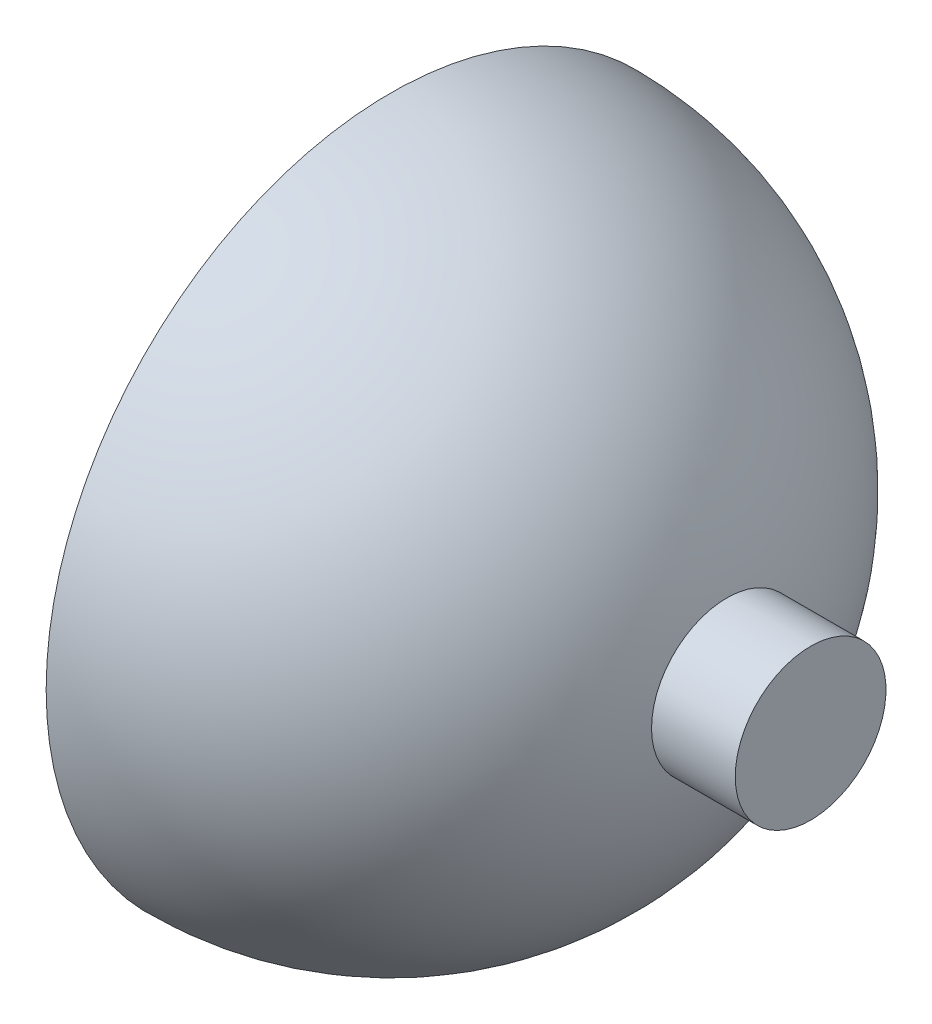
ISO-10303-21;
HEADER;
FILE_DESCRIPTION(('STEP AP214'),'2;1');
FILE_NAME('part.step','',(''),(''),'','','');
FILE_SCHEMA(('AUTOMOTIVE_DESIGN { 1 0 10303 214 1 1 1 1 }'));
ENDSEC;
DATA;
#1=APPLICATION_CONTEXT('core data for automotive mechanical design processes');
#2=APPLICATION_PROTOCOL_DEFINITION('international standard','automotive_design',2000,#1);
#3=PRODUCT_CONTEXT('',#1,'mechanical');
#4=PRODUCT('Part','Part','',(#3));
#5=PRODUCT_RELATED_PRODUCT_CATEGORY('part','',(#4));
#6=PRODUCT_DEFINITION_FORMATION('','',#4);
#7=PRODUCT_DEFINITION_CONTEXT('part definition',#1,'design');
#8=PRODUCT_DEFINITION('design','',#6,#7);
#9=PRODUCT_DEFINITION_SHAPE('','',#8);
#10=(LENGTH_UNIT() NAMED_UNIT(*) SI_UNIT(.MILLI.,.METRE.));
#11=(NAMED_UNIT(*) PLANE_ANGLE_UNIT() SI_UNIT($,.RADIAN.));
#12=(NAMED_UNIT(*) SI_UNIT($,.STERADIAN.) SOLID_ANGLE_UNIT());
#13=UNCERTAINTY_MEASURE_WITH_UNIT(LENGTH_MEASURE(1.E-05),#10,'distance_accuracy_value','');
#14=(GEOMETRIC_REPRESENTATION_CONTEXT(3) GLOBAL_UNCERTAINTY_ASSIGNED_CONTEXT((#13)) GLOBAL_UNIT_ASSIGNED_CONTEXT((#10,
#11,#12)) REPRESENTATION_CONTEXT('',''));
#15=CARTESIAN_POINT('',(0.,0.,0.));
#16=DIRECTION('',(0.,0.,1.));
#17=DIRECTION('',(1.,0.,0.));
#18=AXIS2_PLACEMENT_3D('',#15,#16,#17);
#19=CARTESIAN_POINT('',(0.,0.,0.));
#20=DIRECTION('',(-1.,0.,0.));
#21=DIRECTION('',(0.,1.,0.));
#22=AXIS2_PLACEMENT_3D('',#19,#20,#21);
#23=SPHERICAL_SURFACE('',#22,28.38);
#24=CARTESIAN_POINT('',(0.,0.,0.));
#25=DIRECTION('',(-1.,0.,0.));
#26=DIRECTION('',(0.,0.,1.));
#27=AXIS2_PLACEMENT_3D('',#24,#25,#26);
#28=CIRCLE('',#27,28.38);
#29=CARTESIAN_POINT('',(0.,0.,28.38));
#30=VERTEX_POINT('',#29);
#31=EDGE_CURVE('E47',#30,#30,#28,.T.);
#32=ORIENTED_EDGE('',*,*,#31,.T.);
#33=EDGE_LOOP('',(#32));
#34=FACE_BOUND('',#33,.T.);
#35=ADVANCED_FACE('F33',(#34),#23,.F.);
#36=CARTESIAN_POINT('',(39.,0.,0.));
#37=DIRECTION('',(-1.,0.,0.));
#38=DIRECTION('',(0.,0.,1.));
#39=AXIS2_PLACEMENT_3D('',#36,#37,#38);
#40=PLANE('',#39);
#41=CARTESIAN_POINT('',(39.,0.,0.));
#42=DIRECTION('',(-1.,0.,0.));
#43=DIRECTION('',(0.,0.,1.));
#44=AXIS2_PLACEMENT_3D('',#41,#42,#43);
#45=CIRCLE('',#44,7.);
#46=CARTESIAN_POINT('',(39.,0.,7.));
#47=VERTEX_POINT('',#46);
#48=EDGE_CURVE('E10',#47,#47,#45,.T.);
#49=ORIENTED_EDGE('',*,*,#48,.F.);
#50=EDGE_LOOP('',(#49));
#51=FACE_BOUND('',#50,.T.);
#52=ADVANCED_FACE('F67',(#51),#40,.F.);
#53=CARTESIAN_POINT('',(0.,0.,0.));
#54=DIRECTION('',(-1.,0.,0.));
#55=DIRECTION('',(0.,0.,1.));
#56=AXIS2_PLACEMENT_3D('',#53,#54,#55);
#57=CYLINDRICAL_SURFACE('',#56,7.);
#58=CARTESIAN_POINT('',(31.224989991992,0.,0.));
#59=DIRECTION('',(-1.,0.,0.));
#60=DIRECTION('',(0.,0.,1.));
#61=AXIS2_PLACEMENT_3D('',#58,#59,#60);
#62=CIRCLE('',#61,7.);
#63=CARTESIAN_POINT('',(31.224989991992,0.,7.));
#64=VERTEX_POINT('',#63);
#65=EDGE_CURVE('E39',#64,#64,#62,.T.);
#66=ORIENTED_EDGE('',*,*,#65,.F.);
#67=EDGE_LOOP('',(#66));
#68=FACE_BOUND('',#67,.T.);
#69=ORIENTED_EDGE('',*,*,#48,.T.);
#70=EDGE_LOOP('',(#69));
#71=FACE_BOUND('',#70,.T.);
#72=ADVANCED_FACE('F62',(#68,#71),#57,.T.);
#73=CARTESIAN_POINT('',(0.,0.,0.));
#74=DIRECTION('',(-1.,0.,0.));
#75=DIRECTION('',(0.,1.,0.));
#76=AXIS2_PLACEMENT_3D('',#73,#74,#75);
#77=SPHERICAL_SURFACE('',#76,32.);
#78=CARTESIAN_POINT('',(0.,0.,0.));
#79=DIRECTION('',(-1.,0.,0.));
#80=DIRECTION('',(0.,0.,1.));
#81=AXIS2_PLACEMENT_3D('',#78,#79,#80);
#82=CIRCLE('',#81,32.);
#83=CARTESIAN_POINT('',(0.,0.,32.));
#84=VERTEX_POINT('',#83);
#85=EDGE_CURVE('E43',#84,#84,#82,.T.);
#86=ORIENTED_EDGE('',*,*,#85,.F.);
#87=EDGE_LOOP('',(#86));
#88=FACE_BOUND('',#87,.T.);
#89=ORIENTED_EDGE('',*,*,#65,.T.);
#90=EDGE_LOOP('',(#89));
#91=FACE_BOUND('',#90,.T.);
#92=ADVANCED_FACE('F57',(#88,#91),#77,.T.);
#93=CARTESIAN_POINT('',(0.,0.,0.));
#94=DIRECTION('',(1.,0.,0.));
#95=DIRECTION('',(0.,0.,-1.));
#96=AXIS2_PLACEMENT_3D('',#93,#94,#95);
#97=PLANE('',#96);
#98=ORIENTED_EDGE('',*,*,#31,.F.);
#99=EDGE_LOOP('',(#98));
#100=FACE_BOUND('',#99,.T.);
#101=ORIENTED_EDGE('',*,*,#85,.T.);
#102=EDGE_LOOP('',(#101));
#103=FACE_BOUND('',#102,.T.);
#104=ADVANCED_FACE('F54',(#100,#103),#97,.F.);
#105=CLOSED_SHELL('',(#35,#52,#72,#92,#104));
#106=MANIFOLD_SOLID_BREP('B2',#105);
#107=ADVANCED_BREP_SHAPE_REPRESENTATION('',(#18,#106),#14);
#108=SHAPE_DEFINITION_REPRESENTATION(#9,#107);
ENDSEC;
END-ISO-10303-21;
